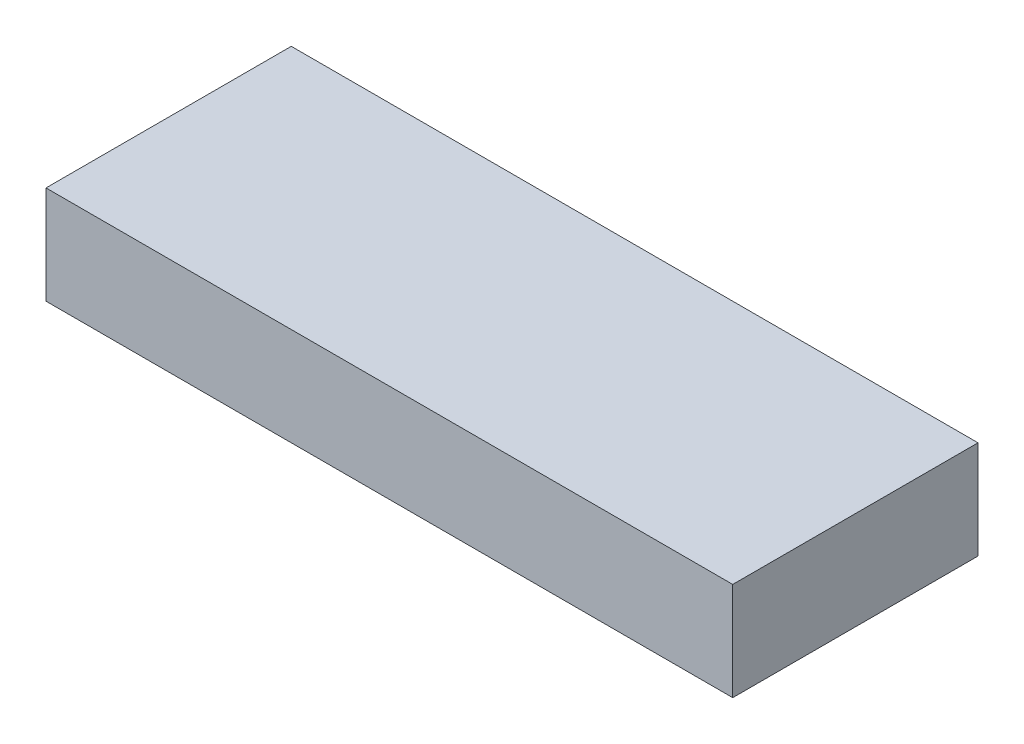
ISO-10303-21;
HEADER;
FILE_DESCRIPTION(('STEP AP214'),'2;1');
FILE_NAME('part.step','',(''),(''),'','','');
FILE_SCHEMA(('AUTOMOTIVE_DESIGN { 1 0 10303 214 1 1 1 1 }'));
ENDSEC;
DATA;
#1=APPLICATION_CONTEXT('core data for automotive mechanical design processes');
#2=APPLICATION_PROTOCOL_DEFINITION('international standard','automotive_design',2000,#1);
#3=PRODUCT_CONTEXT('',#1,'mechanical');
#4=PRODUCT('Part','Part','',(#3));
#5=PRODUCT_RELATED_PRODUCT_CATEGORY('part','',(#4));
#6=PRODUCT_DEFINITION_FORMATION('','',#4);
#7=PRODUCT_DEFINITION_CONTEXT('part definition',#1,'design');
#8=PRODUCT_DEFINITION('design','',#6,#7);
#9=PRODUCT_DEFINITION_SHAPE('','',#8);
#10=(LENGTH_UNIT() NAMED_UNIT(*) SI_UNIT(.MILLI.,.METRE.));
#11=(NAMED_UNIT(*) PLANE_ANGLE_UNIT() SI_UNIT($,.RADIAN.));
#12=(NAMED_UNIT(*) SI_UNIT($,.STERADIAN.) SOLID_ANGLE_UNIT());
#13=UNCERTAINTY_MEASURE_WITH_UNIT(LENGTH_MEASURE(1.E-05),#10,'distance_accuracy_value','');
#14=(GEOMETRIC_REPRESENTATION_CONTEXT(3) GLOBAL_UNCERTAINTY_ASSIGNED_CONTEXT((#13)) GLOBAL_UNIT_ASSIGNED_CONTEXT((#10,
#11,#12)) REPRESENTATION_CONTEXT('',''));
#15=CARTESIAN_POINT('',(0.,0.,0.));
#16=DIRECTION('',(0.,0.,1.));
#17=DIRECTION('',(1.,0.,0.));
#18=AXIS2_PLACEMENT_3D('',#15,#16,#17);
#19=CARTESIAN_POINT('',(44.45,12.7,15.875));
#20=DIRECTION('',(-1.,0.,0.));
#21=DIRECTION('',(0.,0.,1.));
#22=AXIS2_PLACEMENT_3D('',#19,#20,#21);
#23=PLANE('',#22);
#24=DIRECTION('',(0.,0.,-1.));
#25=VECTOR('',#24,1.);
#26=CARTESIAN_POINT('',(44.45,0.,15.875));
#27=LINE('',#26,#25);
#28=CARTESIAN_POINT('',(44.45,0.,15.875));
#29=VERTEX_POINT('',#28);
#30=CARTESIAN_POINT('',(44.45,0.,-15.875));
#31=VERTEX_POINT('',#30);
#32=EDGE_CURVE('E96',#29,#31,#27,.T.);
#33=ORIENTED_EDGE('',*,*,#32,.T.);
#34=DIRECTION('',(0.,-1.,0.));
#35=VECTOR('',#34,1.);
#36=CARTESIAN_POINT('',(44.45,12.7,-15.875));
#37=LINE('',#36,#35);
#38=CARTESIAN_POINT('',(44.45,12.7,-15.875));
#39=VERTEX_POINT('',#38);
#40=EDGE_CURVE('E11',#39,#31,#37,.T.);
#41=ORIENTED_EDGE('',*,*,#40,.F.);
#42=DIRECTION('',(0.,0.,-1.));
#43=VECTOR('',#42,1.);
#44=CARTESIAN_POINT('',(44.45,12.7,15.875));
#45=LINE('',#44,#43);
#46=CARTESIAN_POINT('',(44.45,12.7,15.875));
#47=VERTEX_POINT('',#46);
#48=EDGE_CURVE('E84',#47,#39,#45,.T.);
#49=ORIENTED_EDGE('',*,*,#48,.F.);
#50=DIRECTION('',(0.,-1.,0.));
#51=VECTOR('',#50,1.);
#52=CARTESIAN_POINT('',(44.45,12.7,15.875));
#53=LINE('',#52,#51);
#54=EDGE_CURVE('E92',#47,#29,#53,.T.);
#55=ORIENTED_EDGE('',*,*,#54,.T.);
#56=EDGE_LOOP('',(#33,#41,#49,#55));
#57=FACE_BOUND('',#56,.T.);
#58=ADVANCED_FACE('F33',(#57),#23,.F.);
#59=CARTESIAN_POINT('',(-44.45,12.7,-15.875));
#60=DIRECTION('',(0.,0.,1.));
#61=DIRECTION('',(1.,0.,0.));
#62=AXIS2_PLACEMENT_3D('',#59,#60,#61);
#63=PLANE('',#62);
#64=DIRECTION('',(-1.,0.,0.));
#65=VECTOR('',#64,1.);
#66=CARTESIAN_POINT('',(-44.45,0.,-15.875));
#67=LINE('',#66,#65);
#68=CARTESIAN_POINT('',(-44.45,0.,-15.875));
#69=VERTEX_POINT('',#68);
#70=EDGE_CURVE('E88',#31,#69,#67,.T.);
#71=ORIENTED_EDGE('',*,*,#70,.T.);
#72=DIRECTION('',(0.,-1.,0.));
#73=VECTOR('',#72,1.);
#74=CARTESIAN_POINT('',(-44.45,12.7,-15.875));
#75=LINE('',#74,#73);
#76=CARTESIAN_POINT('',(-44.45,12.7,-15.875));
#77=VERTEX_POINT('',#76);
#78=EDGE_CURVE('E41',#77,#69,#75,.T.);
#79=ORIENTED_EDGE('',*,*,#78,.F.);
#80=DIRECTION('',(-1.,0.,0.));
#81=VECTOR('',#80,1.);
#82=CARTESIAN_POINT('',(-44.45,12.7,-15.875));
#83=LINE('',#82,#81);
#84=EDGE_CURVE('E79',#39,#77,#83,.T.);
#85=ORIENTED_EDGE('',*,*,#84,.F.);
#86=ORIENTED_EDGE('',*,*,#40,.T.);
#87=EDGE_LOOP('',(#71,#79,#85,#86));
#88=FACE_BOUND('',#87,.T.);
#89=ADVANCED_FACE('F87',(#88),#63,.F.);
#90=CARTESIAN_POINT('',(-44.45,12.7,15.875));
#91=DIRECTION('',(1.,0.,0.));
#92=DIRECTION('',(0.,0.,-1.));
#93=AXIS2_PLACEMENT_3D('',#90,#91,#92);
#94=PLANE('',#93);
#95=DIRECTION('',(0.,0.,1.));
#96=VECTOR('',#95,1.);
#97=CARTESIAN_POINT('',(-44.45,0.,15.875));
#98=LINE('',#97,#96);
#99=CARTESIAN_POINT('',(-44.45,0.,15.875));
#100=VERTEX_POINT('',#99);
#101=EDGE_CURVE('E66',#69,#100,#98,.T.);
#102=ORIENTED_EDGE('',*,*,#101,.T.);
#103=DIRECTION('',(0.,-1.,0.));
#104=VECTOR('',#103,1.);
#105=CARTESIAN_POINT('',(-44.45,12.7,15.875));
#106=LINE('',#105,#104);
#107=CARTESIAN_POINT('',(-44.45,12.7,15.875));
#108=VERTEX_POINT('',#107);
#109=EDGE_CURVE('E89',#108,#100,#106,.T.);
#110=ORIENTED_EDGE('',*,*,#109,.F.);
#111=DIRECTION('',(0.,0.,1.));
#112=VECTOR('',#111,1.);
#113=CARTESIAN_POINT('',(-44.45,12.7,15.875));
#114=LINE('',#113,#112);
#115=EDGE_CURVE('E82',#77,#108,#114,.T.);
#116=ORIENTED_EDGE('',*,*,#115,.F.);
#117=ORIENTED_EDGE('',*,*,#78,.T.);
#118=EDGE_LOOP('',(#102,#110,#116,#117));
#119=FACE_BOUND('',#118,.T.);
#120=ADVANCED_FACE('F90',(#119),#94,.F.);
#121=CARTESIAN_POINT('',(-44.45,12.7,15.875));
#122=DIRECTION('',(0.,0.,-1.));
#123=DIRECTION('',(-1.,0.,0.));
#124=AXIS2_PLACEMENT_3D('',#121,#122,#123);
#125=PLANE('',#124);
#126=DIRECTION('',(1.,0.,0.));
#127=VECTOR('',#126,1.);
#128=CARTESIAN_POINT('',(-44.45,0.,15.875));
#129=LINE('',#128,#127);
#130=EDGE_CURVE('E72',#100,#29,#129,.T.);
#131=ORIENTED_EDGE('',*,*,#130,.T.);
#132=ORIENTED_EDGE('',*,*,#54,.F.);
#133=DIRECTION('',(1.,0.,0.));
#134=VECTOR('',#133,1.);
#135=CARTESIAN_POINT('',(-44.45,12.7,15.875));
#136=LINE('',#135,#134);
#137=EDGE_CURVE('E49',#108,#47,#136,.T.);
#138=ORIENTED_EDGE('',*,*,#137,.F.);
#139=ORIENTED_EDGE('',*,*,#109,.T.);
#140=EDGE_LOOP('',(#131,#132,#138,#139));
#141=FACE_BOUND('',#140,.T.);
#142=ADVANCED_FACE('F103',(#141),#125,.F.);
#143=CARTESIAN_POINT('',(0.,12.7,0.));
#144=DIRECTION('',(0.,-1.,0.));
#145=DIRECTION('',(0.,0.,-1.));
#146=AXIS2_PLACEMENT_3D('',#143,#144,#145);
#147=PLANE('',#146);
#148=ORIENTED_EDGE('',*,*,#48,.T.);
#149=ORIENTED_EDGE('',*,*,#84,.T.);
#150=ORIENTED_EDGE('',*,*,#115,.T.);
#151=ORIENTED_EDGE('',*,*,#137,.T.);
#152=EDGE_LOOP('',(#148,#149,#150,#151));
#153=FACE_BOUND('',#152,.T.);
#154=ADVANCED_FACE('F80',(#153),#147,.F.);
#155=CARTESIAN_POINT('',(0.,0.,0.));
#156=DIRECTION('',(0.,-1.,0.));
#157=DIRECTION('',(0.,0.,-1.));
#158=AXIS2_PLACEMENT_3D('',#155,#156,#157);
#159=PLANE('',#158);
#160=ORIENTED_EDGE('',*,*,#32,.F.);
#161=ORIENTED_EDGE('',*,*,#130,.F.);
#162=ORIENTED_EDGE('',*,*,#101,.F.);
#163=ORIENTED_EDGE('',*,*,#70,.F.);
#164=EDGE_LOOP('',(#160,#161,#162,#163));
#165=FACE_BOUND('',#164,.T.);
#166=ADVANCED_FACE('F106',(#165),#159,.T.);
#167=CLOSED_SHELL('',(#58,#89,#120,#142,#154,#166));
#168=MANIFOLD_SOLID_BREP('B2',#167);
#169=ADVANCED_BREP_SHAPE_REPRESENTATION('',(#18,#168),#14);
#170=SHAPE_DEFINITION_REPRESENTATION(#9,#169);
ENDSEC;
END-ISO-10303-21;
